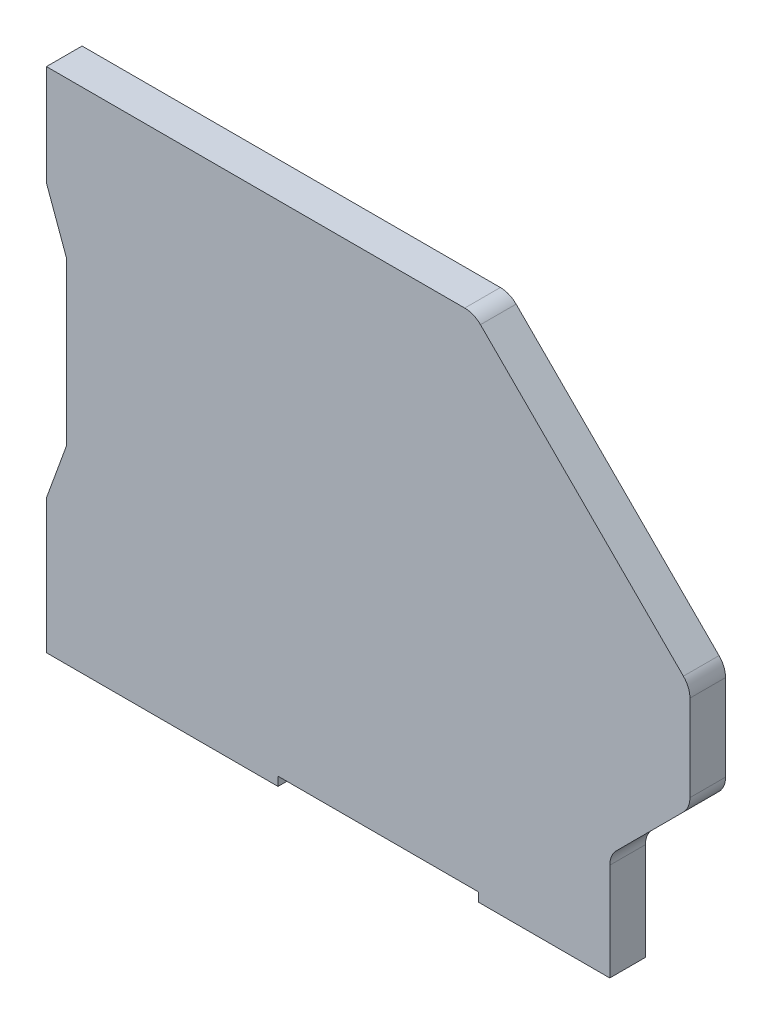
ISO-10303-21;
HEADER;
FILE_DESCRIPTION(('STEP AP214'),'2;1');
FILE_NAME('part.step','',(''),(''),'','','');
FILE_SCHEMA(('AUTOMOTIVE_DESIGN { 1 0 10303 214 1 1 1 1 }'));
ENDSEC;
DATA;
#1=APPLICATION_CONTEXT('core data for automotive mechanical design processes');
#2=APPLICATION_PROTOCOL_DEFINITION('international standard','automotive_design',2000,#1);
#3=PRODUCT_CONTEXT('',#1,'mechanical');
#4=PRODUCT('Part','Part','',(#3));
#5=PRODUCT_RELATED_PRODUCT_CATEGORY('part','',(#4));
#6=PRODUCT_DEFINITION_FORMATION('','',#4);
#7=PRODUCT_DEFINITION_CONTEXT('part definition',#1,'design');
#8=PRODUCT_DEFINITION('design','',#6,#7);
#9=PRODUCT_DEFINITION_SHAPE('','',#8);
#10=(LENGTH_UNIT() NAMED_UNIT(*) SI_UNIT(.MILLI.,.METRE.));
#11=(NAMED_UNIT(*) PLANE_ANGLE_UNIT() SI_UNIT($,.RADIAN.));
#12=(NAMED_UNIT(*) SI_UNIT($,.STERADIAN.) SOLID_ANGLE_UNIT());
#13=UNCERTAINTY_MEASURE_WITH_UNIT(LENGTH_MEASURE(1.E-05),#10,'distance_accuracy_value','');
#14=(GEOMETRIC_REPRESENTATION_CONTEXT(3) GLOBAL_UNCERTAINTY_ASSIGNED_CONTEXT((#13)) GLOBAL_UNIT_ASSIGNED_CONTEXT((#10,
#11,#12)) REPRESENTATION_CONTEXT('',''));
#15=CARTESIAN_POINT('',(0.,0.,0.));
#16=DIRECTION('',(0.,0.,1.));
#17=DIRECTION('',(1.,0.,0.));
#18=AXIS2_PLACEMENT_3D('',#15,#16,#17);
#19=CARTESIAN_POINT('',(-10.5,0.4,0.));
#20=DIRECTION('',(1.,0.,0.));
#21=DIRECTION('',(0.,0.,-1.));
#22=AXIS2_PLACEMENT_3D('',#19,#20,#21);
#23=PLANE('',#22);
#24=DIRECTION('',(0.,1.,0.));
#25=VECTOR('',#24,1.);
#26=CARTESIAN_POINT('',(-10.5,10.823296242811,0.));
#27=LINE('',#26,#25);
#28=CARTESIAN_POINT('',(-10.5,0.,0.));
#29=VERTEX_POINT('',#28);
#30=CARTESIAN_POINT('',(-10.5,0.4,0.));
#31=VERTEX_POINT('',#30);
#32=EDGE_CURVE('E272',#29,#31,#27,.T.);
#33=ORIENTED_EDGE('',*,*,#32,.T.);
#34=DIRECTION('',(0.,0.,-1.));
#35=VECTOR('',#34,1.);
#36=CARTESIAN_POINT('',(-10.5,0.4,0.));
#37=LINE('',#36,#35);
#38=CARTESIAN_POINT('',(-10.5,0.4,1.6));
#39=VERTEX_POINT('',#38);
#40=EDGE_CURVE('E256',#39,#31,#37,.T.);
#41=ORIENTED_EDGE('',*,*,#40,.F.);
#42=DIRECTION('',(0.,1.,0.));
#43=VECTOR('',#42,1.);
#44=CARTESIAN_POINT('',(-10.5,0.4,1.6));
#45=LINE('',#44,#43);
#46=CARTESIAN_POINT('',(-10.5,0.,1.6));
#47=VERTEX_POINT('',#46);
#48=EDGE_CURVE('E298',#39,#47,#45,.F.);
#49=ORIENTED_EDGE('',*,*,#48,.T.);
#50=DIRECTION('',(0.,0.,-1.));
#51=VECTOR('',#50,1.);
#52=CARTESIAN_POINT('',(-10.5,0.,0.));
#53=LINE('',#52,#51);
#54=EDGE_CURVE('E260',#29,#47,#53,.F.);
#55=ORIENTED_EDGE('',*,*,#54,.F.);
#56=EDGE_LOOP('',(#33,#41,#49,#55));
#57=FACE_BOUND('',#56,.T.);
#58=ADVANCED_FACE('F16',(#57),#23,.T.);
#59=CARTESIAN_POINT('',(-1.5,0.,0.));
#60=DIRECTION('',(-1.,0.,0.));
#61=DIRECTION('',(0.,0.,1.));
#62=AXIS2_PLACEMENT_3D('',#59,#60,#61);
#63=PLANE('',#62);
#64=DIRECTION('',(0.,1.,0.));
#65=VECTOR('',#64,1.);
#66=CARTESIAN_POINT('',(-1.5,10.823296242811,0.));
#67=LINE('',#66,#65);
#68=CARTESIAN_POINT('',(-1.5,0.399999999999999,0.));
#69=VERTEX_POINT('',#68);
#70=CARTESIAN_POINT('',(-1.5,0.,0.));
#71=VERTEX_POINT('',#70);
#72=EDGE_CURVE('E274',#69,#71,#67,.F.);
#73=ORIENTED_EDGE('',*,*,#72,.T.);
#74=DIRECTION('',(0.,0.,-1.));
#75=VECTOR('',#74,1.);
#76=CARTESIAN_POINT('',(-1.5,0.,0.));
#77=LINE('',#76,#75);
#78=CARTESIAN_POINT('',(-1.5,0.,1.6));
#79=VERTEX_POINT('',#78);
#80=EDGE_CURVE('E250',#79,#71,#77,.T.);
#81=ORIENTED_EDGE('',*,*,#80,.F.);
#82=DIRECTION('',(0.,1.,0.));
#83=VECTOR('',#82,1.);
#84=CARTESIAN_POINT('',(-1.5,0.,1.6));
#85=LINE('',#84,#83);
#86=CARTESIAN_POINT('',(-1.5,0.4,1.6));
#87=VERTEX_POINT('',#86);
#88=EDGE_CURVE('E157',#79,#87,#85,.T.);
#89=ORIENTED_EDGE('',*,*,#88,.T.);
#90=DIRECTION('',(0.,0.,-1.));
#91=VECTOR('',#90,1.);
#92=CARTESIAN_POINT('',(-1.5,0.4,0.));
#93=LINE('',#92,#91);
#94=EDGE_CURVE('E253',#69,#87,#93,.F.);
#95=ORIENTED_EDGE('',*,*,#94,.F.);
#96=EDGE_LOOP('',(#73,#81,#89,#95));
#97=FACE_BOUND('',#96,.T.);
#98=ADVANCED_FACE('F376',(#97),#63,.T.);
#99=CARTESIAN_POINT('',(5.39999999999982,4.38578643762698,0.));
#100=DIRECTION('',(0.,0.,1.));
#101=DIRECTION('',(1.,0.,0.));
#102=AXIS2_PLACEMENT_3D('',#99,#100,#101);
#103=CYLINDRICAL_SURFACE('',#102,0.999999999999819);
#104=DIRECTION('',(0.,0.,-1.));
#105=VECTOR('',#104,1.);
#106=CARTESIAN_POINT('',(4.4,4.3857864376269,0.));
#107=LINE('',#106,#105);
#108=CARTESIAN_POINT('',(4.4,4.38578643762694,0.));
#109=VERTEX_POINT('',#108);
#110=CARTESIAN_POINT('',(4.4,4.38578643762694,1.6));
#111=VERTEX_POINT('',#110);
#112=EDGE_CURVE('E166',#109,#111,#107,.F.);
#113=ORIENTED_EDGE('',*,*,#112,.F.);
#114=CARTESIAN_POINT('',(5.39999999999982,4.38578643762698,0.));
#115=DIRECTION('',(0.,0.,1.));
#116=DIRECTION('',(1.,0.,0.));
#117=AXIS2_PLACEMENT_3D('',#114,#115,#116);
#118=CIRCLE('',#117,0.999999999999819);
#119=CARTESIAN_POINT('',(4.69289321881345,5.09289321881345,0.));
#120=VERTEX_POINT('',#119);
#121=EDGE_CURVE('E161',#109,#120,#118,.F.);
#122=ORIENTED_EDGE('',*,*,#121,.T.);
#123=DIRECTION('',(0.,0.,1.));
#124=VECTOR('',#123,1.);
#125=CARTESIAN_POINT('',(4.6928932188135,5.0928932188135,0.));
#126=LINE('',#125,#124);
#127=CARTESIAN_POINT('',(4.69289321881345,5.09289321881345,1.6));
#128=VERTEX_POINT('',#127);
#129=EDGE_CURVE('E159',#128,#120,#126,.F.);
#130=ORIENTED_EDGE('',*,*,#129,.F.);
#131=CARTESIAN_POINT('',(5.39999999999982,4.38578643762698,1.6));
#132=DIRECTION('',(0.,0.,1.));
#133=DIRECTION('',(1.,0.,0.));
#134=AXIS2_PLACEMENT_3D('',#131,#132,#133);
#135=CIRCLE('',#134,0.999999999999819);
#136=EDGE_CURVE('E19',#111,#128,#135,.F.);
#137=ORIENTED_EDGE('',*,*,#136,.F.);
#138=EDGE_LOOP('',(#113,#122,#130,#137));
#139=FACE_BOUND('',#138,.T.);
#140=ADVANCED_FACE('F160',(#139),#103,.F.);
#141=CARTESIAN_POINT('',(7.00000000000018,8.81421356237302,0.));
#142=DIRECTION('',(0.,0.,1.));
#143=DIRECTION('',(1.,0.,0.));
#144=AXIS2_PLACEMENT_3D('',#141,#142,#143);
#145=CYLINDRICAL_SURFACE('',#144,0.999999999999818);
#146=CARTESIAN_POINT('',(7.00000000000018,8.81421356237302,0.));
#147=DIRECTION('',(0.,0.,1.));
#148=DIRECTION('',(1.,0.,0.));
#149=AXIS2_PLACEMENT_3D('',#146,#147,#148);
#150=CIRCLE('',#149,0.999999999999818);
#151=CARTESIAN_POINT('',(7.70710678118655,8.10710678118655,0.));
#152=VERTEX_POINT('',#151);
#153=CARTESIAN_POINT('',(8.,8.81421356237306,0.));
#154=VERTEX_POINT('',#153);
#155=EDGE_CURVE('E317',#152,#154,#150,.T.);
#156=ORIENTED_EDGE('',*,*,#155,.T.);
#157=DIRECTION('',(0.,0.,-1.));
#158=VECTOR('',#157,1.);
#159=CARTESIAN_POINT('',(8.,8.8142135623731,0.));
#160=LINE('',#159,#158);
#161=CARTESIAN_POINT('',(8.,8.81421356237306,1.6));
#162=VERTEX_POINT('',#161);
#163=EDGE_CURVE('E232',#162,#154,#160,.T.);
#164=ORIENTED_EDGE('',*,*,#163,.F.);
#165=CARTESIAN_POINT('',(7.00000000000018,8.81421356237302,1.6));
#166=DIRECTION('',(0.,0.,1.));
#167=DIRECTION('',(1.,0.,0.));
#168=AXIS2_PLACEMENT_3D('',#165,#166,#167);
#169=CIRCLE('',#168,0.999999999999818);
#170=CARTESIAN_POINT('',(7.70710678118655,8.10710678118655,1.6));
#171=VERTEX_POINT('',#170);
#172=EDGE_CURVE('E156',#162,#171,#169,.F.);
#173=ORIENTED_EDGE('',*,*,#172,.T.);
#174=DIRECTION('',(0.,0.,1.));
#175=VECTOR('',#174,1.);
#176=CARTESIAN_POINT('',(7.7071067811865,8.1071067811865,0.));
#177=LINE('',#176,#175);
#178=EDGE_CURVE('E171',#152,#171,#177,.T.);
#179=ORIENTED_EDGE('',*,*,#178,.F.);
#180=EDGE_LOOP('',(#156,#164,#173,#179));
#181=FACE_BOUND('',#180,.T.);
#182=ADVANCED_FACE('F324',(#181),#145,.T.);
#183=CARTESIAN_POINT('',(7.0000000000025,12.6857864376274,0.));
#184=DIRECTION('',(0.,0.,1.));
#185=DIRECTION('',(1.,0.,0.));
#186=AXIS2_PLACEMENT_3D('',#183,#184,#185);
#187=CYLINDRICAL_SURFACE('',#186,0.999999999997502);
#188=CARTESIAN_POINT('',(7.0000000000025,12.6857864376274,0.));
#189=DIRECTION('',(0.,0.,1.));
#190=DIRECTION('',(1.,0.,0.));
#191=AXIS2_PLACEMENT_3D('',#188,#189,#190);
#192=CIRCLE('',#191,0.999999999997502);
#193=CARTESIAN_POINT('',(8.,12.6857864376272,0.));
#194=VERTEX_POINT('',#193);
#195=CARTESIAN_POINT('',(7.70710678118691,13.3928932188126,0.));
#196=VERTEX_POINT('',#195);
#197=EDGE_CURVE('E315',#194,#196,#192,.T.);
#198=ORIENTED_EDGE('',*,*,#197,.T.);
#199=DIRECTION('',(0.,0.,1.));
#200=VECTOR('',#199,1.);
#201=CARTESIAN_POINT('',(7.70710678118651,13.392893218813,0.));
#202=LINE('',#201,#200);
#203=CARTESIAN_POINT('',(7.70710678118691,13.3928932188126,1.6));
#204=VERTEX_POINT('',#203);
#205=EDGE_CURVE('E225',#204,#196,#202,.F.);
#206=ORIENTED_EDGE('',*,*,#205,.F.);
#207=CARTESIAN_POINT('',(7.0000000000025,12.6857864376274,1.6));
#208=DIRECTION('',(0.,0.,1.));
#209=DIRECTION('',(1.,0.,0.));
#210=AXIS2_PLACEMENT_3D('',#207,#208,#209);
#211=CIRCLE('',#210,0.999999999997502);
#212=CARTESIAN_POINT('',(8.,12.6857864376272,1.6));
#213=VERTEX_POINT('',#212);
#214=EDGE_CURVE('E321',#204,#213,#211,.F.);
#215=ORIENTED_EDGE('',*,*,#214,.T.);
#216=DIRECTION('',(0.,0.,-1.));
#217=VECTOR('',#216,1.);
#218=CARTESIAN_POINT('',(8.,12.685786437627,0.));
#219=LINE('',#218,#217);
#220=EDGE_CURVE('E229',#194,#213,#219,.F.);
#221=ORIENTED_EDGE('',*,*,#220,.F.);
#222=EDGE_LOOP('',(#198,#206,#215,#221));
#223=FACE_BOUND('',#222,.T.);
#224=ADVANCED_FACE('F333',(#223),#187,.T.);
#225=CARTESIAN_POINT('',(-2.11421356237489,21.7999999999945,0.));
#226=DIRECTION('',(0.,0.,1.));
#227=DIRECTION('',(1.,0.,0.));
#228=AXIS2_PLACEMENT_3D('',#225,#226,#227);
#229=CYLINDRICAL_SURFACE('',#228,1.00000000000553);
#230=CARTESIAN_POINT('',(-2.11421356237489,21.7999999999945,0.));
#231=DIRECTION('',(0.,0.,1.));
#232=DIRECTION('',(1.,0.,0.));
#233=AXIS2_PLACEMENT_3D('',#230,#231,#232);
#234=CIRCLE('',#233,1.00000000000553);
#235=CARTESIAN_POINT('',(-1.40710678118545,22.5071067811859,0.));
#236=VERTEX_POINT('',#235);
#237=CARTESIAN_POINT('',(-2.11421356237399,22.8,0.));
#238=VERTEX_POINT('',#237);
#239=EDGE_CURVE('E271',#236,#238,#234,.T.);
#240=ORIENTED_EDGE('',*,*,#239,.T.);
#241=DIRECTION('',(0.,0.,1.));
#242=VECTOR('',#241,1.);
#243=CARTESIAN_POINT('',(-2.1142135623731,22.8,0.));
#244=LINE('',#243,#242);
#245=CARTESIAN_POINT('',(-2.11421356237399,22.8,1.6));
#246=VERTEX_POINT('',#245);
#247=EDGE_CURVE('E208',#246,#238,#244,.F.);
#248=ORIENTED_EDGE('',*,*,#247,.F.);
#249=CARTESIAN_POINT('',(-2.11421356237489,21.7999999999945,1.6));
#250=DIRECTION('',(0.,0.,1.));
#251=DIRECTION('',(1.,0.,0.));
#252=AXIS2_PLACEMENT_3D('',#249,#250,#251);
#253=CIRCLE('',#252,1.00000000000553);
#254=CARTESIAN_POINT('',(-1.40710678118545,22.5071067811859,1.6));
#255=VERTEX_POINT('',#254);
#256=EDGE_CURVE('E275',#246,#255,#253,.F.);
#257=ORIENTED_EDGE('',*,*,#256,.T.);
#258=DIRECTION('',(0.,0.,1.));
#259=VECTOR('',#258,1.);
#260=CARTESIAN_POINT('',(-1.4071067811865,22.507106781187,0.));
#261=LINE('',#260,#259);
#262=EDGE_CURVE('E212',#236,#255,#261,.T.);
#263=ORIENTED_EDGE('',*,*,#262,.F.);
#264=EDGE_LOOP('',(#240,#248,#257,#263));
#265=FACE_BOUND('',#264,.T.);
#266=ADVANCED_FACE('F386',(#265),#229,.T.);
#267=CARTESIAN_POINT('',(-7.99589720705472,10.823296242811,0.));
#268=DIRECTION('',(0.,0.,1.));
#269=DIRECTION('',(1.,0.,0.));
#270=AXIS2_PLACEMENT_3D('',#267,#268,#269);
#271=PLANE('',#270);
#272=DIRECTION('',(0.,1.,0.));
#273=VECTOR('',#272,1.);
#274=CARTESIAN_POINT('',(-20.9,0.,0.));
#275=LINE('',#274,#273);
#276=CARTESIAN_POINT('',(-20.9,6.0272703224908,0.));
#277=VERTEX_POINT('',#276);
#278=CARTESIAN_POINT('',(-20.9,0.,0.));
#279=VERTEX_POINT('',#278);
#280=EDGE_CURVE('E269',#277,#279,#275,.F.);
#281=ORIENTED_EDGE('',*,*,#280,.F.);
#282=DIRECTION('',(-0.342020143325663,-0.93969262078591,0.));
#283=VECTOR('',#282,1.);
#284=CARTESIAN_POINT('',(-20.9,6.0272703224908,0.));
#285=LINE('',#284,#283);
#286=CARTESIAN_POINT('',(-20.,8.5,0.));
#287=VERTEX_POINT('',#286);
#288=EDGE_CURVE('E193',#287,#277,#285,.T.);
#289=ORIENTED_EDGE('',*,*,#288,.F.);
#290=DIRECTION('',(0.,1.,0.));
#291=VECTOR('',#290,1.);
#292=CARTESIAN_POINT('',(-20.,8.5,0.));
#293=LINE('',#292,#291);
#294=CARTESIAN_POINT('',(-20.,15.8,0.));
#295=VERTEX_POINT('',#294);
#296=EDGE_CURVE('E197',#295,#287,#293,.F.);
#297=ORIENTED_EDGE('',*,*,#296,.F.);
#298=DIRECTION('',(0.342020143325688,-0.939692620785901,0.));
#299=VECTOR('',#298,1.);
#300=CARTESIAN_POINT('',(-20.,15.8,0.));
#301=LINE('',#300,#299);
#302=CARTESIAN_POINT('',(-20.9,18.272729677509,0.));
#303=VERTEX_POINT('',#302);
#304=EDGE_CURVE('E202',#303,#295,#301,.T.);
#305=ORIENTED_EDGE('',*,*,#304,.F.);
#306=DIRECTION('',(0.,1.,0.));
#307=VECTOR('',#306,1.);
#308=CARTESIAN_POINT('',(-20.9,18.272729677509,0.));
#309=LINE('',#308,#307);
#310=CARTESIAN_POINT('',(-20.9,22.8,0.));
#311=VERTEX_POINT('',#310);
#312=EDGE_CURVE('E207',#311,#303,#309,.F.);
#313=ORIENTED_EDGE('',*,*,#312,.F.);
#314=DIRECTION('',(1.,0.,0.));
#315=VECTOR('',#314,1.);
#316=CARTESIAN_POINT('',(-20.9,22.8,0.));
#317=LINE('',#316,#315);
#318=EDGE_CURVE('E211',#238,#311,#317,.F.);
#319=ORIENTED_EDGE('',*,*,#318,.F.);
#320=ORIENTED_EDGE('',*,*,#239,.F.);
#321=DIRECTION('',(-0.707106781186509,0.707106781186586,0.));
#322=VECTOR('',#321,1.);
#323=CARTESIAN_POINT('',(-1.4071067811865,22.507106781187,0.));
#324=LINE('',#323,#322);
#325=EDGE_CURVE('E228',#196,#236,#324,.T.);
#326=ORIENTED_EDGE('',*,*,#325,.F.);
#327=ORIENTED_EDGE('',*,*,#197,.F.);
#328=DIRECTION('',(0.,1.,0.));
#329=VECTOR('',#328,1.);
#330=CARTESIAN_POINT('',(8.,12.685786437627,0.));
#331=LINE('',#330,#329);
#332=EDGE_CURVE('E235',#154,#194,#331,.T.);
#333=ORIENTED_EDGE('',*,*,#332,.F.);
#334=ORIENTED_EDGE('',*,*,#155,.F.);
#335=DIRECTION('',(0.707106781186547,0.707106781186548,0.));
#336=VECTOR('',#335,1.);
#337=CARTESIAN_POINT('',(7.7071067811865,8.1071067811865,0.));
#338=LINE('',#337,#336);
#339=EDGE_CURVE('E165',#120,#152,#338,.T.);
#340=ORIENTED_EDGE('',*,*,#339,.F.);
#341=ORIENTED_EDGE('',*,*,#121,.F.);
#342=DIRECTION('',(0.,1.,0.));
#343=VECTOR('',#342,1.);
#344=CARTESIAN_POINT('',(4.4,4.3857864376269,0.));
#345=LINE('',#344,#343);
#346=CARTESIAN_POINT('',(4.4,0.,0.));
#347=VERTEX_POINT('',#346);
#348=EDGE_CURVE('E240',#347,#109,#345,.T.);
#349=ORIENTED_EDGE('',*,*,#348,.F.);
#350=DIRECTION('',(1.,0.,0.));
#351=VECTOR('',#350,1.);
#352=CARTESIAN_POINT('',(4.4,0.,0.));
#353=LINE('',#352,#351);
#354=EDGE_CURVE('E244',#71,#347,#353,.T.);
#355=ORIENTED_EDGE('',*,*,#354,.F.);
#356=ORIENTED_EDGE('',*,*,#72,.F.);
#357=DIRECTION('',(1.,0.,0.));
#358=VECTOR('',#357,1.);
#359=CARTESIAN_POINT('',(-1.5,0.4,0.));
#360=LINE('',#359,#358);
#361=EDGE_CURVE('E259',#31,#69,#360,.T.);
#362=ORIENTED_EDGE('',*,*,#361,.F.);
#363=ORIENTED_EDGE('',*,*,#32,.F.);
#364=DIRECTION('',(1.,0.,0.));
#365=VECTOR('',#364,1.);
#366=CARTESIAN_POINT('',(-10.5,0.,0.));
#367=LINE('',#366,#365);
#368=EDGE_CURVE('E263',#279,#29,#367,.T.);
#369=ORIENTED_EDGE('',*,*,#368,.F.);
#370=EDGE_LOOP('',(#281,#289,#297,#305,#313,#319,#320,#326,#327,#333,#334,#340,#341,#349,#355,
#356,#362,#363,#369));
#371=FACE_BOUND('',#370,.T.);
#372=ADVANCED_FACE('F355',(#371),#271,.F.);
#373=CARTESIAN_POINT('',(-20.9,0.,0.));
#374=DIRECTION('',(-1.,0.,0.));
#375=DIRECTION('',(0.,0.,1.));
#376=AXIS2_PLACEMENT_3D('',#373,#374,#375);
#377=PLANE('',#376);
#378=ORIENTED_EDGE('',*,*,#280,.T.);
#379=DIRECTION('',(0.,0.,-1.));
#380=VECTOR('',#379,1.);
#381=CARTESIAN_POINT('',(-20.9,0.,0.));
#382=LINE('',#381,#380);
#383=CARTESIAN_POINT('',(-20.9,0.,1.6));
#384=VERTEX_POINT('',#383);
#385=EDGE_CURVE('E266',#384,#279,#382,.T.);
#386=ORIENTED_EDGE('',*,*,#385,.F.);
#387=DIRECTION('',(0.,1.,0.));
#388=VECTOR('',#387,1.);
#389=CARTESIAN_POINT('',(-20.9,10.823296242811,1.6));
#390=LINE('',#389,#388);
#391=CARTESIAN_POINT('',(-20.9,6.0272703224908,1.6));
#392=VERTEX_POINT('',#391);
#393=EDGE_CURVE('E187',#392,#384,#390,.F.);
#394=ORIENTED_EDGE('',*,*,#393,.F.);
#395=DIRECTION('',(0.,0.,1.));
#396=VECTOR('',#395,1.);
#397=CARTESIAN_POINT('',(-20.9,6.0272703224908,0.));
#398=LINE('',#397,#396);
#399=EDGE_CURVE('E190',#277,#392,#398,.T.);
#400=ORIENTED_EDGE('',*,*,#399,.F.);
#401=EDGE_LOOP('',(#378,#386,#394,#400));
#402=FACE_BOUND('',#401,.T.);
#403=ADVANCED_FACE('F361',(#402),#377,.T.);
#404=CARTESIAN_POINT('',(-10.5,0.,0.));
#405=DIRECTION('',(0.,-1.,0.));
#406=DIRECTION('',(0.,0.,-1.));
#407=AXIS2_PLACEMENT_3D('',#404,#405,#406);
#408=PLANE('',#407);
#409=ORIENTED_EDGE('',*,*,#368,.T.);
#410=ORIENTED_EDGE('',*,*,#54,.T.);
#411=DIRECTION('',(1.,0.,0.));
#412=VECTOR('',#411,1.);
#413=CARTESIAN_POINT('',(-7.99589720705472,0.,1.6));
#414=LINE('',#413,#412);
#415=EDGE_CURVE('E183',#384,#47,#414,.T.);
#416=ORIENTED_EDGE('',*,*,#415,.F.);
#417=ORIENTED_EDGE('',*,*,#385,.T.);
#418=EDGE_LOOP('',(#409,#410,#416,#417));
#419=FACE_BOUND('',#418,.T.);
#420=ADVANCED_FACE('F365',(#419),#408,.T.);
#421=CARTESIAN_POINT('',(-1.5,0.4,0.));
#422=DIRECTION('',(0.,-1.,0.));
#423=DIRECTION('',(0.,0.,-1.));
#424=AXIS2_PLACEMENT_3D('',#421,#422,#423);
#425=PLANE('',#424);
#426=ORIENTED_EDGE('',*,*,#361,.T.);
#427=ORIENTED_EDGE('',*,*,#94,.T.);
#428=DIRECTION('',(1.,0.,0.));
#429=VECTOR('',#428,1.);
#430=CARTESIAN_POINT('',(-7.99589720705472,0.399999999999999,1.6));
#431=LINE('',#430,#429);
#432=EDGE_CURVE('E186',#39,#87,#431,.T.);
#433=ORIENTED_EDGE('',*,*,#432,.F.);
#434=ORIENTED_EDGE('',*,*,#40,.T.);
#435=EDGE_LOOP('',(#426,#427,#433,#434));
#436=FACE_BOUND('',#435,.T.);
#437=ADVANCED_FACE('F371',(#436),#425,.T.);
#438=CARTESIAN_POINT('',(4.4,0.,0.));
#439=DIRECTION('',(0.,-1.,0.));
#440=DIRECTION('',(0.,0.,-1.));
#441=AXIS2_PLACEMENT_3D('',#438,#439,#440);
#442=PLANE('',#441);
#443=ORIENTED_EDGE('',*,*,#354,.T.);
#444=DIRECTION('',(0.,0.,-1.));
#445=VECTOR('',#444,1.);
#446=CARTESIAN_POINT('',(4.4,0.,0.));
#447=LINE('',#446,#445);
#448=CARTESIAN_POINT('',(4.4,0.,1.6));
#449=VERTEX_POINT('',#448);
#450=EDGE_CURVE('E241',#449,#347,#447,.T.);
#451=ORIENTED_EDGE('',*,*,#450,.F.);
#452=DIRECTION('',(1.,0.,0.));
#453=VECTOR('',#452,1.);
#454=CARTESIAN_POINT('',(-7.99589720705472,0.,1.6));
#455=LINE('',#454,#453);
#456=EDGE_CURVE('E177',#79,#449,#455,.T.);
#457=ORIENTED_EDGE('',*,*,#456,.F.);
#458=ORIENTED_EDGE('',*,*,#80,.T.);
#459=EDGE_LOOP('',(#443,#451,#457,#458));
#460=FACE_BOUND('',#459,.T.);
#461=ADVANCED_FACE('F379',(#460),#442,.T.);
#462=CARTESIAN_POINT('',(4.4,4.3857864376269,0.));
#463=DIRECTION('',(1.,0.,0.));
#464=DIRECTION('',(0.,0.,-1.));
#465=AXIS2_PLACEMENT_3D('',#462,#463,#464);
#466=PLANE('',#465);
#467=ORIENTED_EDGE('',*,*,#348,.T.);
#468=ORIENTED_EDGE('',*,*,#112,.T.);
#469=DIRECTION('',(0.,1.,0.));
#470=VECTOR('',#469,1.);
#471=CARTESIAN_POINT('',(4.4,10.823296242811,1.6));
#472=LINE('',#471,#470);
#473=EDGE_CURVE('E155',#449,#111,#472,.T.);
#474=ORIENTED_EDGE('',*,*,#473,.F.);
#475=ORIENTED_EDGE('',*,*,#450,.T.);
#476=EDGE_LOOP('',(#467,#468,#474,#475));
#477=FACE_BOUND('',#476,.T.);
#478=ADVANCED_FACE('F382',(#477),#466,.T.);
#479=CARTESIAN_POINT('',(7.7071067811865,8.1071067811865,0.));
#480=DIRECTION('',(0.707106781186548,-0.707106781186547,0.));
#481=DIRECTION('',(0.707106781186547,0.707106781186548,0.));
#482=AXIS2_PLACEMENT_3D('',#479,#480,#481);
#483=PLANE('',#482);
#484=ORIENTED_EDGE('',*,*,#339,.T.);
#485=ORIENTED_EDGE('',*,*,#178,.T.);
#486=DIRECTION('',(0.707106781186547,0.707106781186548,0.));
#487=VECTOR('',#486,1.);
#488=CARTESIAN_POINT('',(4.6928932188135,5.0928932188135,1.6));
#489=LINE('',#488,#487);
#490=EDGE_CURVE('E152',#128,#171,#489,.T.);
#491=ORIENTED_EDGE('',*,*,#490,.F.);
#492=ORIENTED_EDGE('',*,*,#129,.T.);
#493=EDGE_LOOP('',(#484,#485,#491,#492));
#494=FACE_BOUND('',#493,.T.);
#495=ADVANCED_FACE('F169',(#494),#483,.T.);
#496=CARTESIAN_POINT('',(8.,12.685786437627,0.));
#497=DIRECTION('',(1.,0.,0.));
#498=DIRECTION('',(0.,0.,-1.));
#499=AXIS2_PLACEMENT_3D('',#496,#497,#498);
#500=PLANE('',#499);
#501=ORIENTED_EDGE('',*,*,#332,.T.);
#502=ORIENTED_EDGE('',*,*,#220,.T.);
#503=DIRECTION('',(0.,1.,0.));
#504=VECTOR('',#503,1.);
#505=CARTESIAN_POINT('',(8.,10.823296242811,1.6));
#506=LINE('',#505,#504);
#507=EDGE_CURVE('E172',#162,#213,#506,.T.);
#508=ORIENTED_EDGE('',*,*,#507,.F.);
#509=ORIENTED_EDGE('',*,*,#163,.T.);
#510=EDGE_LOOP('',(#501,#502,#508,#509));
#511=FACE_BOUND('',#510,.T.);
#512=ADVANCED_FACE('F329',(#511),#500,.T.);
#513=CARTESIAN_POINT('',(-1.4071067811865,22.507106781187,0.));
#514=DIRECTION('',(0.707106781186586,0.707106781186509,0.));
#515=DIRECTION('',(-0.707106781186509,0.707106781186586,0.));
#516=AXIS2_PLACEMENT_3D('',#513,#514,#515);
#517=PLANE('',#516);
#518=ORIENTED_EDGE('',*,*,#325,.T.);
#519=ORIENTED_EDGE('',*,*,#262,.T.);
#520=DIRECTION('',(-0.707106781186509,0.707106781186587,0.));
#521=VECTOR('',#520,1.);
#522=CARTESIAN_POINT('',(7.7071067811865,13.392893218813,1.6));
#523=LINE('',#522,#521);
#524=EDGE_CURVE('E175',#204,#255,#523,.T.);
#525=ORIENTED_EDGE('',*,*,#524,.F.);
#526=ORIENTED_EDGE('',*,*,#205,.T.);
#527=EDGE_LOOP('',(#518,#519,#525,#526));
#528=FACE_BOUND('',#527,.T.);
#529=ADVANCED_FACE('F337',(#528),#517,.T.);
#530=CARTESIAN_POINT('',(-20.9,22.8,0.));
#531=DIRECTION('',(0.,1.,0.));
#532=DIRECTION('',(0.,0.,1.));
#533=AXIS2_PLACEMENT_3D('',#530,#531,#532);
#534=PLANE('',#533);
#535=ORIENTED_EDGE('',*,*,#318,.T.);
#536=DIRECTION('',(0.,0.,1.));
#537=VECTOR('',#536,1.);
#538=CARTESIAN_POINT('',(-20.9,22.8,0.));
#539=LINE('',#538,#537);
#540=CARTESIAN_POINT('',(-20.9,22.8,1.6));
#541=VERTEX_POINT('',#540);
#542=EDGE_CURVE('E220',#541,#311,#539,.F.);
#543=ORIENTED_EDGE('',*,*,#542,.F.);
#544=DIRECTION('',(1.,0.,0.));
#545=VECTOR('',#544,1.);
#546=CARTESIAN_POINT('',(-7.99589720705472,22.8,1.6));
#547=LINE('',#546,#545);
#548=EDGE_CURVE('E217',#246,#541,#547,.F.);
#549=ORIENTED_EDGE('',*,*,#548,.F.);
#550=ORIENTED_EDGE('',*,*,#247,.T.);
#551=EDGE_LOOP('',(#535,#543,#549,#550));
#552=FACE_BOUND('',#551,.T.);
#553=ADVANCED_FACE('F390',(#552),#534,.T.);
#554=CARTESIAN_POINT('',(-20.9,18.272729677509,0.));
#555=DIRECTION('',(-1.,0.,0.));
#556=DIRECTION('',(0.,0.,1.));
#557=AXIS2_PLACEMENT_3D('',#554,#555,#556);
#558=PLANE('',#557);
#559=ORIENTED_EDGE('',*,*,#312,.T.);
#560=DIRECTION('',(0.,0.,1.));
#561=VECTOR('',#560,1.);
#562=CARTESIAN_POINT('',(-20.9,18.272729677509,0.));
#563=LINE('',#562,#561);
#564=CARTESIAN_POINT('',(-20.9,18.272729677509,1.6));
#565=VERTEX_POINT('',#564);
#566=EDGE_CURVE('E204',#565,#303,#563,.F.);
#567=ORIENTED_EDGE('',*,*,#566,.F.);
#568=DIRECTION('',(0.,1.,0.));
#569=VECTOR('',#568,1.);
#570=CARTESIAN_POINT('',(-20.9,10.823296242811,1.6));
#571=LINE('',#570,#569);
#572=EDGE_CURVE('E213',#541,#565,#571,.F.);
#573=ORIENTED_EDGE('',*,*,#572,.F.);
#574=ORIENTED_EDGE('',*,*,#542,.T.);
#575=EDGE_LOOP('',(#559,#567,#573,#574));
#576=FACE_BOUND('',#575,.T.);
#577=ADVANCED_FACE('F392',(#576),#558,.T.);
#578=CARTESIAN_POINT('',(-20.,15.8,0.));
#579=DIRECTION('',(-0.939692620785901,-0.342020143325688,0.));
#580=DIRECTION('',(0.342020143325688,-0.939692620785901,0.));
#581=AXIS2_PLACEMENT_3D('',#578,#579,#580);
#582=PLANE('',#581);
#583=ORIENTED_EDGE('',*,*,#304,.T.);
#584=DIRECTION('',(0.,0.,1.));
#585=VECTOR('',#584,1.);
#586=CARTESIAN_POINT('',(-20.,15.8,0.));
#587=LINE('',#586,#585);
#588=CARTESIAN_POINT('',(-20.,15.8,1.6));
#589=VERTEX_POINT('',#588);
#590=EDGE_CURVE('E199',#589,#295,#587,.F.);
#591=ORIENTED_EDGE('',*,*,#590,.F.);
#592=DIRECTION('',(0.342020143325688,-0.939692620785901,0.));
#593=VECTOR('',#592,1.);
#594=CARTESIAN_POINT('',(-20.9,18.272729677509,1.6));
#595=LINE('',#594,#593);
#596=EDGE_CURVE('E216',#565,#589,#595,.T.);
#597=ORIENTED_EDGE('',*,*,#596,.F.);
#598=ORIENTED_EDGE('',*,*,#566,.T.);
#599=EDGE_LOOP('',(#583,#591,#597,#598));
#600=FACE_BOUND('',#599,.T.);
#601=ADVANCED_FACE('F351',(#600),#582,.T.);
#602=CARTESIAN_POINT('',(-20.,8.5,0.));
#603=DIRECTION('',(-1.,0.,0.));
#604=DIRECTION('',(0.,0.,1.));
#605=AXIS2_PLACEMENT_3D('',#602,#603,#604);
#606=PLANE('',#605);
#607=ORIENTED_EDGE('',*,*,#296,.T.);
#608=DIRECTION('',(0.,0.,1.));
#609=VECTOR('',#608,1.);
#610=CARTESIAN_POINT('',(-20.,8.5,0.));
#611=LINE('',#610,#609);
#612=CARTESIAN_POINT('',(-20.,8.5,1.6));
#613=VERTEX_POINT('',#612);
#614=EDGE_CURVE('E34',#613,#287,#611,.F.);
#615=ORIENTED_EDGE('',*,*,#614,.F.);
#616=DIRECTION('',(0.,1.,0.));
#617=VECTOR('',#616,1.);
#618=CARTESIAN_POINT('',(-20.,10.823296242811,1.6));
#619=LINE('',#618,#617);
#620=EDGE_CURVE('E25',#589,#613,#619,.F.);
#621=ORIENTED_EDGE('',*,*,#620,.F.);
#622=ORIENTED_EDGE('',*,*,#590,.T.);
#623=EDGE_LOOP('',(#607,#615,#621,#622));
#624=FACE_BOUND('',#623,.T.);
#625=ADVANCED_FACE('F347',(#624),#606,.T.);
#626=CARTESIAN_POINT('',(-20.9,6.0272703224908,0.));
#627=DIRECTION('',(-0.93969262078591,0.342020143325663,0.));
#628=DIRECTION('',(-0.342020143325663,-0.93969262078591,0.));
#629=AXIS2_PLACEMENT_3D('',#626,#627,#628);
#630=PLANE('',#629);
#631=ORIENTED_EDGE('',*,*,#288,.T.);
#632=ORIENTED_EDGE('',*,*,#399,.T.);
#633=DIRECTION('',(-0.342020143325663,-0.939692620785911,0.));
#634=VECTOR('',#633,1.);
#635=CARTESIAN_POINT('',(-20.,8.5,1.6));
#636=LINE('',#635,#634);
#637=EDGE_CURVE('E11',#613,#392,#636,.T.);
#638=ORIENTED_EDGE('',*,*,#637,.F.);
#639=ORIENTED_EDGE('',*,*,#614,.T.);
#640=EDGE_LOOP('',(#631,#632,#638,#639));
#641=FACE_BOUND('',#640,.T.);
#642=ADVANCED_FACE('F359',(#641),#630,.T.);
#643=CARTESIAN_POINT('',(-7.99589720705472,10.823296242811,1.6));
#644=DIRECTION('',(0.,0.,1.));
#645=DIRECTION('',(1.,0.,0.));
#646=AXIS2_PLACEMENT_3D('',#643,#644,#645);
#647=PLANE('',#646);
#648=ORIENTED_EDGE('',*,*,#620,.T.);
#649=ORIENTED_EDGE('',*,*,#637,.T.);
#650=ORIENTED_EDGE('',*,*,#393,.T.);
#651=ORIENTED_EDGE('',*,*,#415,.T.);
#652=ORIENTED_EDGE('',*,*,#48,.F.);
#653=ORIENTED_EDGE('',*,*,#432,.T.);
#654=ORIENTED_EDGE('',*,*,#88,.F.);
#655=ORIENTED_EDGE('',*,*,#456,.T.);
#656=ORIENTED_EDGE('',*,*,#473,.T.);
#657=ORIENTED_EDGE('',*,*,#136,.T.);
#658=ORIENTED_EDGE('',*,*,#490,.T.);
#659=ORIENTED_EDGE('',*,*,#172,.F.);
#660=ORIENTED_EDGE('',*,*,#507,.T.);
#661=ORIENTED_EDGE('',*,*,#214,.F.);
#662=ORIENTED_EDGE('',*,*,#524,.T.);
#663=ORIENTED_EDGE('',*,*,#256,.F.);
#664=ORIENTED_EDGE('',*,*,#548,.T.);
#665=ORIENTED_EDGE('',*,*,#572,.T.);
#666=ORIENTED_EDGE('',*,*,#596,.T.);
#667=EDGE_LOOP('',(#648,#649,#650,#651,#652,#653,#654,#655,#656,#657,#658,#659,#660,#661,#662,
#663,#664,#665,#666));
#668=FACE_BOUND('',#667,.T.);
#669=ADVANCED_FACE('F150',(#668),#647,.T.);
#670=CLOSED_SHELL('',(#58,#98,#140,#182,#224,#266,#372,#403,#420,#437,#461,#478,#495,#512,#529,
#553,#577,#601,#625,#642,#669));
#671=MANIFOLD_SOLID_BREP('B1',#670);
#672=ADVANCED_BREP_SHAPE_REPRESENTATION('',(#18,#671),#14);
#673=SHAPE_DEFINITION_REPRESENTATION(#9,#672);
ENDSEC;
END-ISO-10303-21;
